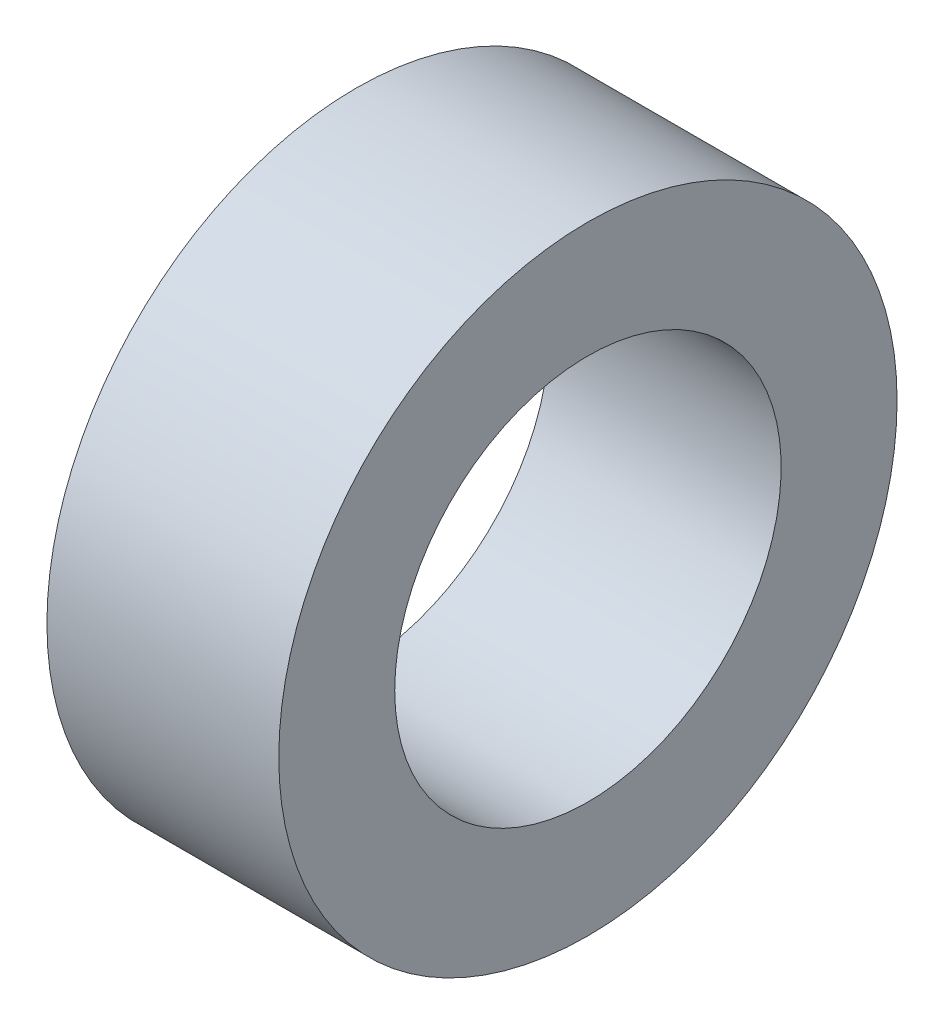
ISO-10303-21;
HEADER;
FILE_DESCRIPTION(('STEP AP214'),'2;1');
FILE_NAME('part.step','',(''),(''),'','','');
FILE_SCHEMA(('AUTOMOTIVE_DESIGN { 1 0 10303 214 1 1 1 1 }'));
ENDSEC;
DATA;
#1=APPLICATION_CONTEXT('core data for automotive mechanical design processes');
#2=APPLICATION_PROTOCOL_DEFINITION('international standard','automotive_design',2000,#1);
#3=PRODUCT_CONTEXT('',#1,'mechanical');
#4=PRODUCT('Part','Part','',(#3));
#5=PRODUCT_RELATED_PRODUCT_CATEGORY('part','',(#4));
#6=PRODUCT_DEFINITION_FORMATION('','',#4);
#7=PRODUCT_DEFINITION_CONTEXT('part definition',#1,'design');
#8=PRODUCT_DEFINITION('design','',#6,#7);
#9=PRODUCT_DEFINITION_SHAPE('','',#8);
#10=(LENGTH_UNIT() NAMED_UNIT(*) SI_UNIT(.MILLI.,.METRE.));
#11=(NAMED_UNIT(*) PLANE_ANGLE_UNIT() SI_UNIT($,.RADIAN.));
#12=(NAMED_UNIT(*) SI_UNIT($,.STERADIAN.) SOLID_ANGLE_UNIT());
#13=UNCERTAINTY_MEASURE_WITH_UNIT(LENGTH_MEASURE(1.E-05),#10,'distance_accuracy_value','');
#14=(GEOMETRIC_REPRESENTATION_CONTEXT(3) GLOBAL_UNCERTAINTY_ASSIGNED_CONTEXT((#13)) GLOBAL_UNIT_ASSIGNED_CONTEXT((#10,
#11,#12)) REPRESENTATION_CONTEXT('',''));
#15=CARTESIAN_POINT('',(0.,0.,0.));
#16=DIRECTION('',(0.,0.,1.));
#17=DIRECTION('',(1.,0.,0.));
#18=AXIS2_PLACEMENT_3D('',#15,#16,#17);
#19=CARTESIAN_POINT('',(0.,5.,0.));
#20=DIRECTION('',(1.,0.,0.));
#21=DIRECTION('',(0.,0.,-1.));
#22=AXIS2_PLACEMENT_3D('',#19,#20,#21);
#23=PLANE('',#22);
#24=CARTESIAN_POINT('',(0.,0.,0.));
#25=DIRECTION('',(-1.,0.,0.));
#26=DIRECTION('',(0.,0.,1.));
#27=AXIS2_PLACEMENT_3D('',#24,#25,#26);
#28=CIRCLE('',#27,5.);
#29=CARTESIAN_POINT('',(0.,0.,5.));
#30=VERTEX_POINT('',#29);
#31=EDGE_CURVE('E60',#30,#30,#28,.T.);
#32=ORIENTED_EDGE('',*,*,#31,.F.);
#33=EDGE_LOOP('',(#32));
#34=FACE_BOUND('',#33,.T.);
#35=CARTESIAN_POINT('',(0.,0.,0.));
#36=DIRECTION('',(-1.,0.,0.));
#37=DIRECTION('',(0.,0.,1.));
#38=AXIS2_PLACEMENT_3D('',#35,#36,#37);
#39=CIRCLE('',#38,8.);
#40=CARTESIAN_POINT('',(0.,0.,8.));
#41=VERTEX_POINT('',#40);
#42=EDGE_CURVE('E10',#41,#41,#39,.T.);
#43=ORIENTED_EDGE('',*,*,#42,.T.);
#44=EDGE_LOOP('',(#43));
#45=FACE_BOUND('',#44,.T.);
#46=ADVANCED_FACE('F43',(#34,#45),#23,.F.);
#47=CARTESIAN_POINT('',(0.,0.,0.));
#48=DIRECTION('',(-1.,0.,0.));
#49=DIRECTION('',(0.,0.,1.));
#50=AXIS2_PLACEMENT_3D('',#47,#48,#49);
#51=CYLINDRICAL_SURFACE('',#50,8.);
#52=ORIENTED_EDGE('',*,*,#42,.F.);
#53=EDGE_LOOP('',(#52));
#54=FACE_BOUND('',#53,.T.);
#55=CARTESIAN_POINT('',(6.,0.,0.));
#56=DIRECTION('',(-1.,0.,0.));
#57=DIRECTION('',(0.,0.,1.));
#58=AXIS2_PLACEMENT_3D('',#55,#56,#57);
#59=CIRCLE('',#58,8.);
#60=CARTESIAN_POINT('',(6.,0.,8.));
#61=VERTEX_POINT('',#60);
#62=EDGE_CURVE('E50',#61,#61,#59,.T.);
#63=ORIENTED_EDGE('',*,*,#62,.T.);
#64=EDGE_LOOP('',(#63));
#65=FACE_BOUND('',#64,.T.);
#66=ADVANCED_FACE('F70',(#54,#65),#51,.T.);
#67=CARTESIAN_POINT('',(6.,5.,0.));
#68=DIRECTION('',(-1.,0.,0.));
#69=DIRECTION('',(0.,0.,1.));
#70=AXIS2_PLACEMENT_3D('',#67,#68,#69);
#71=PLANE('',#70);
#72=ORIENTED_EDGE('',*,*,#62,.F.);
#73=EDGE_LOOP('',(#72));
#74=FACE_BOUND('',#73,.T.);
#75=CARTESIAN_POINT('',(6.,0.,0.));
#76=DIRECTION('',(-1.,0.,0.));
#77=DIRECTION('',(0.,0.,1.));
#78=AXIS2_PLACEMENT_3D('',#75,#76,#77);
#79=CIRCLE('',#78,5.);
#80=CARTESIAN_POINT('',(6.,0.,5.));
#81=VERTEX_POINT('',#80);
#82=EDGE_CURVE('E55',#81,#81,#79,.T.);
#83=ORIENTED_EDGE('',*,*,#82,.T.);
#84=EDGE_LOOP('',(#83));
#85=FACE_BOUND('',#84,.T.);
#86=ADVANCED_FACE('F74',(#74,#85),#71,.F.);
#87=CARTESIAN_POINT('',(0.,0.,0.));
#88=DIRECTION('',(-1.,0.,0.));
#89=DIRECTION('',(0.,0.,1.));
#90=AXIS2_PLACEMENT_3D('',#87,#88,#89);
#91=CYLINDRICAL_SURFACE('',#90,5.);
#92=ORIENTED_EDGE('',*,*,#82,.F.);
#93=EDGE_LOOP('',(#92));
#94=FACE_BOUND('',#93,.T.);
#95=ORIENTED_EDGE('',*,*,#31,.T.);
#96=EDGE_LOOP('',(#95));
#97=FACE_BOUND('',#96,.T.);
#98=ADVANCED_FACE('F67',(#94,#97),#91,.F.);
#99=CLOSED_SHELL('',(#46,#66,#86,#98));
#100=MANIFOLD_SOLID_BREP('B2',#99);
#101=ADVANCED_BREP_SHAPE_REPRESENTATION('',(#18,#100),#14);
#102=SHAPE_DEFINITION_REPRESENTATION(#9,#101);
ENDSEC;
END-ISO-10303-21;
